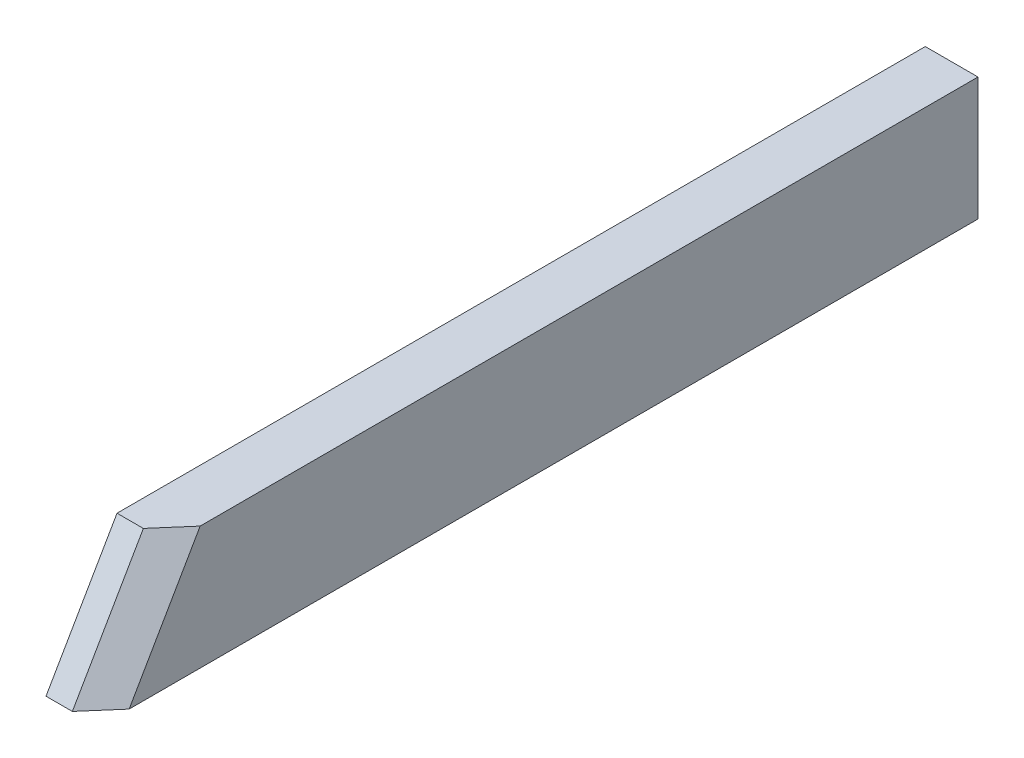
ISO-10303-21;
HEADER;
FILE_DESCRIPTION(('STEP AP214'),'2;1');
FILE_NAME('part.step','',(''),(''),'','','');
FILE_SCHEMA(('AUTOMOTIVE_DESIGN { 1 0 10303 214 1 1 1 1 }'));
ENDSEC;
DATA;
#1=APPLICATION_CONTEXT('core data for automotive mechanical design processes');
#2=APPLICATION_PROTOCOL_DEFINITION('international standard','automotive_design',2000,#1);
#3=PRODUCT_CONTEXT('',#1,'mechanical');
#4=PRODUCT('Part','Part','',(#3));
#5=PRODUCT_RELATED_PRODUCT_CATEGORY('part','',(#4));
#6=PRODUCT_DEFINITION_FORMATION('','',#4);
#7=PRODUCT_DEFINITION_CONTEXT('part definition',#1,'design');
#8=PRODUCT_DEFINITION('design','',#6,#7);
#9=PRODUCT_DEFINITION_SHAPE('','',#8);
#10=(LENGTH_UNIT() NAMED_UNIT(*) SI_UNIT(.MILLI.,.METRE.));
#11=(NAMED_UNIT(*) PLANE_ANGLE_UNIT() SI_UNIT($,.RADIAN.));
#12=(NAMED_UNIT(*) SI_UNIT($,.STERADIAN.) SOLID_ANGLE_UNIT());
#13=UNCERTAINTY_MEASURE_WITH_UNIT(LENGTH_MEASURE(1.E-05),#10,'distance_accuracy_value','');
#14=(GEOMETRIC_REPRESENTATION_CONTEXT(3) GLOBAL_UNCERTAINTY_ASSIGNED_CONTEXT((#13)) GLOBAL_UNIT_ASSIGNED_CONTEXT((#10,
#11,#12)) REPRESENTATION_CONTEXT('',''));
#15=CARTESIAN_POINT('',(0.,0.,0.));
#16=DIRECTION('',(0.,0.,1.));
#17=DIRECTION('',(1.,0.,0.));
#18=AXIS2_PLACEMENT_3D('',#15,#16,#17);
#19=CARTESIAN_POINT('',(-581.025,552.45,14.6646968374158));
#20=DIRECTION('',(0.707106781186515,0.353553390593307,0.612372435695813));
#21=DIRECTION('',(0.654653670708006,0.,-0.75592894601843));
#22=AXIS2_PLACEMENT_3D('',#19,#20,#21);
#23=PLANE('',#22);
#24=DIRECTION('',(0.,-0.866025403784429,0.500000000000017));
#25=VECTOR('',#24,1.);
#26=CARTESIAN_POINT('',(-590.55,596.9,0.));
#27=LINE('',#26,#25);
#28=CARTESIAN_POINT('',(-590.550000000001,507.999999999998,51.3264389309628));
#29=VERTEX_POINT('',#28);
#30=CARTESIAN_POINT('',(-590.55,596.9,-3.09748497016763E-13));
#31=VERTEX_POINT('',#30);
#32=EDGE_CURVE('E82',#29,#31,#27,.F.);
#33=ORIENTED_EDGE('',*,*,#32,.F.);
#34=DIRECTION('',(-0.654653670707735,0.,0.755928946018664));
#35=VECTOR('',#34,1.);
#36=CARTESIAN_POINT('',(-571.5,508.,29.3293936748266));
#37=LINE('',#36,#35);
#38=CARTESIAN_POINT('',(-571.499999999999,508.,29.3293936748279));
#39=VERTEX_POINT('',#38);
#40=EDGE_CURVE('E63',#39,#29,#37,.T.);
#41=ORIENTED_EDGE('',*,*,#40,.F.);
#42=DIRECTION('',(0.,-0.86602540378447,0.499999999999946));
#43=VECTOR('',#42,1.);
#44=CARTESIAN_POINT('',(-571.5,596.9,-21.9970452561238));
#45=LINE('',#44,#43);
#46=CARTESIAN_POINT('',(-571.5,596.9,-21.997045256124));
#47=VERTEX_POINT('',#46);
#48=EDGE_CURVE('E19',#47,#39,#45,.T.);
#49=ORIENTED_EDGE('',*,*,#48,.F.);
#50=DIRECTION('',(0.654653670707994,0.,-0.75592894601844));
#51=VECTOR('',#50,1.);
#52=CARTESIAN_POINT('',(-590.55,596.9,0.));
#53=LINE('',#52,#51);
#54=EDGE_CURVE('E59',#31,#47,#53,.T.);
#55=ORIENTED_EDGE('',*,*,#54,.F.);
#56=EDGE_LOOP('',(#33,#41,#49,#55));
#57=FACE_BOUND('',#56,.T.);
#58=ADVANCED_FACE('F16',(#57),#23,.T.);
#59=CARTESIAN_POINT('',(-571.5,0.,0.));
#60=DIRECTION('',(1.,0.,0.));
#61=DIRECTION('',(0.,0.,-1.));
#62=AXIS2_PLACEMENT_3D('',#59,#60,#61);
#63=PLANE('',#62);
#64=DIRECTION('',(0.,0.,1.));
#65=VECTOR('',#64,1.);
#66=CARTESIAN_POINT('',(-571.5,596.9,-584.2));
#67=LINE('',#66,#65);
#68=CARTESIAN_POINT('',(-571.5,596.9,-584.2));
#69=VERTEX_POINT('',#68);
#70=EDGE_CURVE('E68',#47,#69,#67,.F.);
#71=ORIENTED_EDGE('',*,*,#70,.F.);
#72=ORIENTED_EDGE('',*,*,#48,.T.);
#73=DIRECTION('',(0.,0.,-1.));
#74=VECTOR('',#73,1.);
#75=CARTESIAN_POINT('',(-571.5,508.,51.3264389309656));
#76=LINE('',#75,#74);
#77=CARTESIAN_POINT('',(-571.5,508.,-584.2));
#78=VERTEX_POINT('',#77);
#79=EDGE_CURVE('E86',#78,#39,#76,.F.);
#80=ORIENTED_EDGE('',*,*,#79,.F.);
#81=DIRECTION('',(0.,1.,0.));
#82=VECTOR('',#81,1.);
#83=CARTESIAN_POINT('',(-571.5,508.,-584.2));
#84=LINE('',#83,#82);
#85=EDGE_CURVE('E79',#69,#78,#84,.F.);
#86=ORIENTED_EDGE('',*,*,#85,.F.);
#87=EDGE_LOOP('',(#71,#72,#80,#86));
#88=FACE_BOUND('',#87,.T.);
#89=ADVANCED_FACE('F78',(#88),#63,.T.);
#90=CARTESIAN_POINT('',(-609.6,596.9,-584.2));
#91=DIRECTION('',(0.,1.,0.));
#92=DIRECTION('',(0.,0.,1.));
#93=AXIS2_PLACEMENT_3D('',#90,#91,#92);
#94=PLANE('',#93);
#95=DIRECTION('',(1.,0.,0.));
#96=VECTOR('',#95,1.);
#97=CARTESIAN_POINT('',(-609.6,596.9,0.));
#98=LINE('',#97,#96);
#99=CARTESIAN_POINT('',(-609.6,596.9,0.));
#100=VERTEX_POINT('',#99);
#101=EDGE_CURVE('E75',#31,#100,#98,.F.);
#102=ORIENTED_EDGE('',*,*,#101,.F.);
#103=ORIENTED_EDGE('',*,*,#54,.T.);
#104=ORIENTED_EDGE('',*,*,#70,.T.);
#105=DIRECTION('',(-1.,0.,0.));
#106=VECTOR('',#105,1.);
#107=CARTESIAN_POINT('',(-609.6,596.9,-584.2));
#108=LINE('',#107,#106);
#109=CARTESIAN_POINT('',(-609.6,596.9,-584.2));
#110=VERTEX_POINT('',#109);
#111=EDGE_CURVE('E89',#110,#69,#108,.F.);
#112=ORIENTED_EDGE('',*,*,#111,.F.);
#113=DIRECTION('',(0.,0.,-1.));
#114=VECTOR('',#113,1.);
#115=CARTESIAN_POINT('',(-609.6,596.9,0.));
#116=LINE('',#115,#114);
#117=EDGE_CURVE('E93',#110,#100,#116,.F.);
#118=ORIENTED_EDGE('',*,*,#117,.T.);
#119=EDGE_LOOP('',(#102,#103,#104,#112,#118));
#120=FACE_BOUND('',#119,.T.);
#121=ADVANCED_FACE('F71',(#120),#94,.T.);
#122=CARTESIAN_POINT('',(-609.6,596.9,0.));
#123=DIRECTION('',(0.,0.500000000000017,0.866025403784429));
#124=DIRECTION('',(0.,-0.866025403784429,0.500000000000017));
#125=AXIS2_PLACEMENT_3D('',#122,#123,#124);
#126=PLANE('',#125);
#127=DIRECTION('',(1.,0.,0.));
#128=VECTOR('',#127,1.);
#129=CARTESIAN_POINT('',(-609.6,508.,51.3264389309656));
#130=LINE('',#129,#128);
#131=CARTESIAN_POINT('',(-609.6,507.999999999999,51.3264389309635));
#132=VERTEX_POINT('',#131);
#133=EDGE_CURVE('E84',#29,#132,#130,.F.);
#134=ORIENTED_EDGE('',*,*,#133,.F.);
#135=ORIENTED_EDGE('',*,*,#32,.T.);
#136=ORIENTED_EDGE('',*,*,#101,.T.);
#137=DIRECTION('',(0.,-0.866025403784406,0.500000000000058));
#138=VECTOR('',#137,1.);
#139=CARTESIAN_POINT('',(-609.6,596.9,0.));
#140=LINE('',#139,#138);
#141=EDGE_CURVE('E95',#100,#132,#140,.T.);
#142=ORIENTED_EDGE('',*,*,#141,.T.);
#143=EDGE_LOOP('',(#134,#135,#136,#142));
#144=FACE_BOUND('',#143,.T.);
#145=ADVANCED_FACE('F107',(#144),#126,.T.);
#146=CARTESIAN_POINT('',(-609.6,508.,51.3264389309656));
#147=DIRECTION('',(0.,-1.,0.));
#148=DIRECTION('',(0.,0.,-1.));
#149=AXIS2_PLACEMENT_3D('',#146,#147,#148);
#150=PLANE('',#149);
#151=ORIENTED_EDGE('',*,*,#79,.T.);
#152=ORIENTED_EDGE('',*,*,#40,.T.);
#153=ORIENTED_EDGE('',*,*,#133,.T.);
#154=DIRECTION('',(0.,0.,-1.));
#155=VECTOR('',#154,1.);
#156=CARTESIAN_POINT('',(-609.6,508.,0.));
#157=LINE('',#156,#155);
#158=CARTESIAN_POINT('',(-609.6,508.,-584.2));
#159=VERTEX_POINT('',#158);
#160=EDGE_CURVE('E25',#132,#159,#157,.T.);
#161=ORIENTED_EDGE('',*,*,#160,.T.);
#162=DIRECTION('',(-1.,0.,0.));
#163=VECTOR('',#162,1.);
#164=CARTESIAN_POINT('',(-609.6,508.,-584.2));
#165=LINE('',#164,#163);
#166=EDGE_CURVE('E33',#78,#159,#165,.T.);
#167=ORIENTED_EDGE('',*,*,#166,.F.);
#168=EDGE_LOOP('',(#151,#152,#153,#161,#167));
#169=FACE_BOUND('',#168,.T.);
#170=ADVANCED_FACE('F101',(#169),#150,.T.);
#171=CARTESIAN_POINT('',(-609.6,508.,-584.2));
#172=DIRECTION('',(0.,0.,-1.));
#173=DIRECTION('',(-1.,0.,0.));
#174=AXIS2_PLACEMENT_3D('',#171,#172,#173);
#175=PLANE('',#174);
#176=ORIENTED_EDGE('',*,*,#166,.T.);
#177=DIRECTION('',(0.,1.,0.));
#178=VECTOR('',#177,1.);
#179=CARTESIAN_POINT('',(-609.6,0.,-584.2));
#180=LINE('',#179,#178);
#181=EDGE_CURVE('E11',#159,#110,#180,.T.);
#182=ORIENTED_EDGE('',*,*,#181,.T.);
#183=ORIENTED_EDGE('',*,*,#111,.T.);
#184=ORIENTED_EDGE('',*,*,#85,.T.);
#185=EDGE_LOOP('',(#176,#182,#183,#184));
#186=FACE_BOUND('',#185,.T.);
#187=ADVANCED_FACE('F115',(#186),#175,.T.);
#188=CARTESIAN_POINT('',(-609.6,0.,0.));
#189=DIRECTION('',(1.,0.,0.));
#190=DIRECTION('',(0.,0.,-1.));
#191=AXIS2_PLACEMENT_3D('',#188,#189,#190);
#192=PLANE('',#191);
#193=ORIENTED_EDGE('',*,*,#160,.F.);
#194=ORIENTED_EDGE('',*,*,#141,.F.);
#195=ORIENTED_EDGE('',*,*,#117,.F.);
#196=ORIENTED_EDGE('',*,*,#181,.F.);
#197=EDGE_LOOP('',(#193,#194,#195,#196));
#198=FACE_BOUND('',#197,.T.);
#199=ADVANCED_FACE('F105',(#198),#192,.F.);
#200=CLOSED_SHELL('',(#58,#89,#121,#145,#170,#187,#199));
#201=MANIFOLD_SOLID_BREP('B1',#200);
#202=ADVANCED_BREP_SHAPE_REPRESENTATION('',(#18,#201),#14);
#203=SHAPE_DEFINITION_REPRESENTATION(#9,#202);
ENDSEC;
END-ISO-10303-21;
